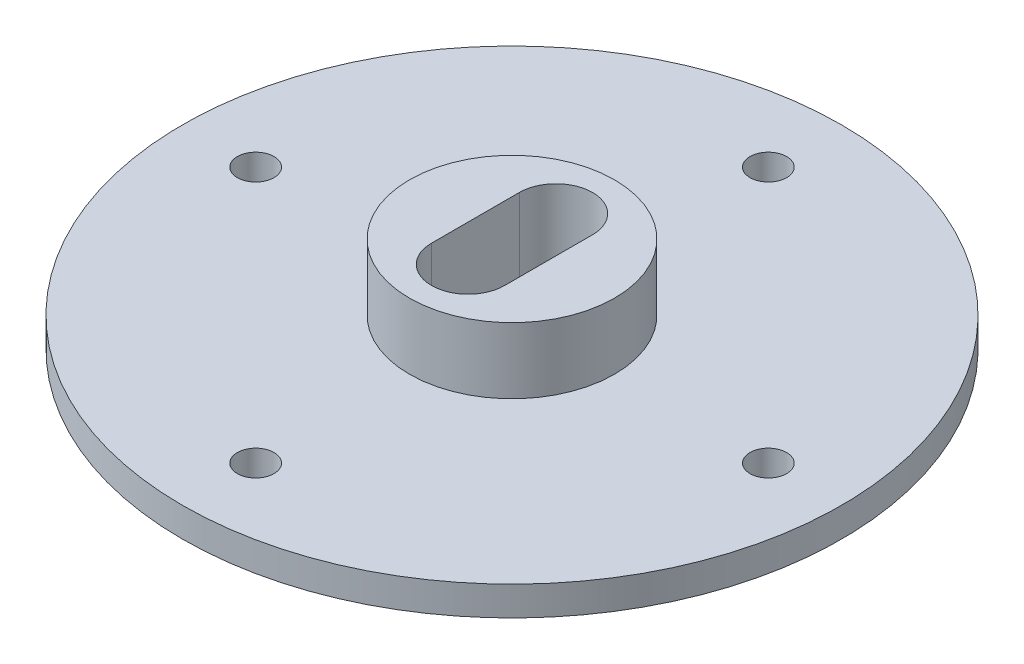
ISO-10303-21;
HEADER;
FILE_DESCRIPTION(('STEP AP214'),'2;1');
FILE_NAME('part.step','',(''),(''),'','','');
FILE_SCHEMA(('AUTOMOTIVE_DESIGN { 1 0 10303 214 1 1 1 1 }'));
ENDSEC;
DATA;
#1=APPLICATION_CONTEXT('core data for automotive mechanical design processes');
#2=APPLICATION_PROTOCOL_DEFINITION('international standard','automotive_design',2000,#1);
#3=PRODUCT_CONTEXT('',#1,'mechanical');
#4=PRODUCT('Part','Part','',(#3));
#5=PRODUCT_RELATED_PRODUCT_CATEGORY('part','',(#4));
#6=PRODUCT_DEFINITION_FORMATION('','',#4);
#7=PRODUCT_DEFINITION_CONTEXT('part definition',#1,'design');
#8=PRODUCT_DEFINITION('design','',#6,#7);
#9=PRODUCT_DEFINITION_SHAPE('','',#8);
#10=(LENGTH_UNIT() NAMED_UNIT(*) SI_UNIT(.MILLI.,.METRE.));
#11=(NAMED_UNIT(*) PLANE_ANGLE_UNIT() SI_UNIT($,.RADIAN.));
#12=(NAMED_UNIT(*) SI_UNIT($,.STERADIAN.) SOLID_ANGLE_UNIT());
#13=UNCERTAINTY_MEASURE_WITH_UNIT(LENGTH_MEASURE(1.E-05),#10,'distance_accuracy_value','');
#14=(GEOMETRIC_REPRESENTATION_CONTEXT(3) GLOBAL_UNCERTAINTY_ASSIGNED_CONTEXT((#13)) GLOBAL_UNIT_ASSIGNED_CONTEXT((#10,
#11,#12)) REPRESENTATION_CONTEXT('',''));
#15=CARTESIAN_POINT('',(0.,0.,0.));
#16=DIRECTION('',(0.,0.,1.));
#17=DIRECTION('',(1.,0.,0.));
#18=AXIS2_PLACEMENT_3D('',#15,#16,#17);
#19=CARTESIAN_POINT('',(0.,4.,-35.));
#20=DIRECTION('',(0.,-1.,0.));
#21=DIRECTION('',(0.,0.,-1.));
#22=AXIS2_PLACEMENT_3D('',#19,#20,#21);
#23=CYLINDRICAL_SURFACE('',#22,2.5);
#24=CARTESIAN_POINT('',(0.,4.,-35.));
#25=DIRECTION('',(0.,1.,0.));
#26=DIRECTION('',(0.,0.,1.));
#27=AXIS2_PLACEMENT_3D('',#24,#25,#26);
#28=CIRCLE('',#27,2.5);
#29=CARTESIAN_POINT('',(0.,4.,-32.5));
#30=VERTEX_POINT('',#29);
#31=EDGE_CURVE('E55',#30,#30,#28,.T.);
#32=ORIENTED_EDGE('',*,*,#31,.T.);
#33=EDGE_LOOP('',(#32));
#34=FACE_BOUND('',#33,.T.);
#35=CARTESIAN_POINT('',(0.,0.,-35.));
#36=DIRECTION('',(0.,1.,0.));
#37=DIRECTION('',(0.,0.,1.));
#38=AXIS2_PLACEMENT_3D('',#35,#36,#37);
#39=CIRCLE('',#38,2.5);
#40=CARTESIAN_POINT('',(0.,0.,-32.5));
#41=VERTEX_POINT('',#40);
#42=EDGE_CURVE('E171',#41,#41,#39,.T.);
#43=ORIENTED_EDGE('',*,*,#42,.F.);
#44=EDGE_LOOP('',(#43));
#45=FACE_BOUND('',#44,.T.);
#46=ADVANCED_FACE('F45',(#34,#45),#23,.F.);
#47=CARTESIAN_POINT('',(35.000000000001,4.,-9.88330434368617E-13));
#48=DIRECTION('',(0.,-1.,0.));
#49=DIRECTION('',(0.,0.,-1.));
#50=AXIS2_PLACEMENT_3D('',#47,#48,#49);
#51=CYLINDRICAL_SURFACE('',#50,2.50000000000077);
#52=CARTESIAN_POINT('',(35.000000000001,4.,-9.88330434368617E-13));
#53=DIRECTION('',(0.,1.,0.));
#54=DIRECTION('',(0.,0.,1.));
#55=AXIS2_PLACEMENT_3D('',#52,#53,#54);
#56=CIRCLE('',#55,2.50000000000077);
#57=CARTESIAN_POINT('',(35.000000000001,4.,2.49999999999979));
#58=VERTEX_POINT('',#57);
#59=EDGE_CURVE('E154',#58,#58,#56,.T.);
#60=ORIENTED_EDGE('',*,*,#59,.T.);
#61=EDGE_LOOP('',(#60));
#62=FACE_BOUND('',#61,.T.);
#63=CARTESIAN_POINT('',(35.000000000001,0.,-9.88330434368617E-13));
#64=DIRECTION('',(0.,1.,0.));
#65=DIRECTION('',(0.,0.,1.));
#66=AXIS2_PLACEMENT_3D('',#63,#64,#65);
#67=CIRCLE('',#66,2.50000000000077);
#68=CARTESIAN_POINT('',(35.000000000001,0.,2.49999999999979));
#69=VERTEX_POINT('',#68);
#70=EDGE_CURVE('E168',#69,#69,#67,.T.);
#71=ORIENTED_EDGE('',*,*,#70,.F.);
#72=EDGE_LOOP('',(#71));
#73=FACE_BOUND('',#72,.T.);
#74=ADVANCED_FACE('F197',(#62,#73),#51,.F.);
#75=CARTESIAN_POINT('',(1.97666086873723E-12,4.,35.));
#76=DIRECTION('',(0.,-1.,0.));
#77=DIRECTION('',(0.,0.,-1.));
#78=AXIS2_PLACEMENT_3D('',#75,#76,#77);
#79=CYLINDRICAL_SURFACE('',#78,2.50000000000213);
#80=CARTESIAN_POINT('',(1.97666086873723E-12,4.,35.));
#81=DIRECTION('',(0.,1.,0.));
#82=DIRECTION('',(0.,0.,1.));
#83=AXIS2_PLACEMENT_3D('',#80,#81,#82);
#84=CIRCLE('',#83,2.50000000000213);
#85=CARTESIAN_POINT('',(1.97666086873723E-12,4.,37.5000000000021));
#86=VERTEX_POINT('',#85);
#87=EDGE_CURVE('E150',#86,#86,#84,.T.);
#88=ORIENTED_EDGE('',*,*,#87,.T.);
#89=EDGE_LOOP('',(#88));
#90=FACE_BOUND('',#89,.T.);
#91=CARTESIAN_POINT('',(1.97666086873723E-12,0.,35.));
#92=DIRECTION('',(0.,1.,0.));
#93=DIRECTION('',(0.,0.,1.));
#94=AXIS2_PLACEMENT_3D('',#91,#92,#93);
#95=CIRCLE('',#94,2.50000000000213);
#96=CARTESIAN_POINT('',(1.97666086873723E-12,0.,37.5000000000021));
#97=VERTEX_POINT('',#96);
#98=EDGE_CURVE('E164',#97,#97,#95,.T.);
#99=ORIENTED_EDGE('',*,*,#98,.F.);
#100=EDGE_LOOP('',(#99));
#101=FACE_BOUND('',#100,.T.);
#102=ADVANCED_FACE('F203',(#90,#101),#79,.F.);
#103=CARTESIAN_POINT('',(-34.999999999999,4.,9.92616698165632E-13));
#104=DIRECTION('',(0.,-1.,0.));
#105=DIRECTION('',(0.,0.,-1.));
#106=AXIS2_PLACEMENT_3D('',#103,#104,#105);
#107=CYLINDRICAL_SURFACE('',#106,2.50000000000159);
#108=CARTESIAN_POINT('',(-34.999999999999,4.,9.92616698165632E-13));
#109=DIRECTION('',(0.,1.,0.));
#110=DIRECTION('',(0.,0.,1.));
#111=AXIS2_PLACEMENT_3D('',#108,#109,#110);
#112=CIRCLE('',#111,2.50000000000159);
#113=CARTESIAN_POINT('',(-34.999999999999,4.,2.50000000000258));
#114=VERTEX_POINT('',#113);
#115=EDGE_CURVE('E146',#114,#114,#112,.T.);
#116=ORIENTED_EDGE('',*,*,#115,.T.);
#117=EDGE_LOOP('',(#116));
#118=FACE_BOUND('',#117,.T.);
#119=CARTESIAN_POINT('',(-34.999999999999,0.,9.92616698165632E-13));
#120=DIRECTION('',(0.,1.,0.));
#121=DIRECTION('',(0.,0.,1.));
#122=AXIS2_PLACEMENT_3D('',#119,#120,#121);
#123=CIRCLE('',#122,2.50000000000159);
#124=CARTESIAN_POINT('',(-34.999999999999,0.,2.50000000000258));
#125=VERTEX_POINT('',#124);
#126=EDGE_CURVE('E145',#125,#125,#123,.T.);
#127=ORIENTED_EDGE('',*,*,#126,.F.);
#128=EDGE_LOOP('',(#127));
#129=FACE_BOUND('',#128,.T.);
#130=ADVANCED_FACE('F47',(#118,#129),#107,.F.);
#131=CARTESIAN_POINT('',(0.,4.,0.));
#132=DIRECTION('',(0.,-1.,0.));
#133=DIRECTION('',(0.,0.,-1.));
#134=AXIS2_PLACEMENT_3D('',#131,#132,#133);
#135=CYLINDRICAL_SURFACE('',#134,45.);
#136=CARTESIAN_POINT('',(0.,4.,0.));
#137=DIRECTION('',(0.,1.,0.));
#138=DIRECTION('',(0.,0.,1.));
#139=AXIS2_PLACEMENT_3D('',#136,#137,#138);
#140=CIRCLE('',#139,45.);
#141=CARTESIAN_POINT('',(0.,4.,45.));
#142=VERTEX_POINT('',#141);
#143=EDGE_CURVE('E11',#142,#142,#140,.T.);
#144=ORIENTED_EDGE('',*,*,#143,.F.);
#145=EDGE_LOOP('',(#144));
#146=FACE_BOUND('',#145,.T.);
#147=CARTESIAN_POINT('',(0.,0.,0.));
#148=DIRECTION('',(0.,1.,0.));
#149=DIRECTION('',(0.,0.,1.));
#150=AXIS2_PLACEMENT_3D('',#147,#148,#149);
#151=CIRCLE('',#150,45.);
#152=CARTESIAN_POINT('',(0.,0.,45.));
#153=VERTEX_POINT('',#152);
#154=EDGE_CURVE('E49',#153,#153,#151,.T.);
#155=ORIENTED_EDGE('',*,*,#154,.T.);
#156=EDGE_LOOP('',(#155));
#157=FACE_BOUND('',#156,.T.);
#158=ADVANCED_FACE('F180',(#146,#157),#135,.T.);
#159=CARTESIAN_POINT('',(0.,4.,0.));
#160=DIRECTION('',(0.,1.,0.));
#161=DIRECTION('',(0.,0.,1.));
#162=AXIS2_PLACEMENT_3D('',#159,#160,#161);
#163=PLANE('',#162);
#164=CARTESIAN_POINT('',(0.,4.,0.));
#165=DIRECTION('',(0.,1.,0.));
#166=DIRECTION('',(0.,0.,1.));
#167=AXIS2_PLACEMENT_3D('',#164,#165,#166);
#168=CIRCLE('',#167,14.);
#169=CARTESIAN_POINT('',(0.,4.,-14.));
#170=VERTEX_POINT('',#169);
#171=EDGE_CURVE('E141',#170,#170,#168,.F.);
#172=ORIENTED_EDGE('',*,*,#171,.T.);
#173=EDGE_LOOP('',(#172));
#174=FACE_BOUND('',#173,.T.);
#175=ORIENTED_EDGE('',*,*,#115,.F.);
#176=EDGE_LOOP('',(#175));
#177=FACE_BOUND('',#176,.T.);
#178=ORIENTED_EDGE('',*,*,#87,.F.);
#179=EDGE_LOOP('',(#178));
#180=FACE_BOUND('',#179,.T.);
#181=ORIENTED_EDGE('',*,*,#59,.F.);
#182=EDGE_LOOP('',(#181));
#183=FACE_BOUND('',#182,.T.);
#184=ORIENTED_EDGE('',*,*,#31,.F.);
#185=EDGE_LOOP('',(#184));
#186=FACE_BOUND('',#185,.T.);
#187=ORIENTED_EDGE('',*,*,#143,.T.);
#188=EDGE_LOOP('',(#187));
#189=FACE_BOUND('',#188,.T.);
#190=ADVANCED_FACE('F184',(#174,#177,#180,#183,#186,#189),#163,.T.);
#191=CARTESIAN_POINT('',(0.,0.,0.));
#192=DIRECTION('',(0.,1.,0.));
#193=DIRECTION('',(0.,0.,1.));
#194=AXIS2_PLACEMENT_3D('',#191,#192,#193);
#195=PLANE('',#194);
#196=DIRECTION('',(0.,0.,1.));
#197=VECTOR('',#196,1.);
#198=CARTESIAN_POINT('',(-5.,0.,6.));
#199=LINE('',#198,#197);
#200=CARTESIAN_POINT('',(-5.,0.,-6.));
#201=VERTEX_POINT('',#200);
#202=CARTESIAN_POINT('',(-5.,0.,6.));
#203=VERTEX_POINT('',#202);
#204=EDGE_CURVE('E98',#201,#203,#199,.T.);
#205=ORIENTED_EDGE('',*,*,#204,.T.);
#206=CARTESIAN_POINT('',(0.,0.,6.));
#207=DIRECTION('',(0.,1.,0.));
#208=DIRECTION('',(0.,0.,1.));
#209=AXIS2_PLACEMENT_3D('',#206,#207,#208);
#210=CIRCLE('',#209,5.);
#211=CARTESIAN_POINT('',(5.,0.,6.));
#212=VERTEX_POINT('',#211);
#213=EDGE_CURVE('E91',#203,#212,#210,.T.);
#214=ORIENTED_EDGE('',*,*,#213,.T.);
#215=DIRECTION('',(0.,0.,-1.));
#216=VECTOR('',#215,1.);
#217=CARTESIAN_POINT('',(5.,0.,6.));
#218=LINE('',#217,#216);
#219=CARTESIAN_POINT('',(5.,0.,-6.));
#220=VERTEX_POINT('',#219);
#221=EDGE_CURVE('E101',#212,#220,#218,.T.);
#222=ORIENTED_EDGE('',*,*,#221,.T.);
#223=CARTESIAN_POINT('',(0.,0.,-6.));
#224=DIRECTION('',(0.,1.,0.));
#225=DIRECTION('',(0.,0.,1.));
#226=AXIS2_PLACEMENT_3D('',#223,#224,#225);
#227=CIRCLE('',#226,5.);
#228=EDGE_CURVE('E63',#220,#201,#227,.T.);
#229=ORIENTED_EDGE('',*,*,#228,.T.);
#230=EDGE_LOOP('',(#205,#214,#222,#229));
#231=FACE_BOUND('',#230,.T.);
#232=ORIENTED_EDGE('',*,*,#126,.T.);
#233=EDGE_LOOP('',(#232));
#234=FACE_BOUND('',#233,.T.);
#235=ORIENTED_EDGE('',*,*,#98,.T.);
#236=EDGE_LOOP('',(#235));
#237=FACE_BOUND('',#236,.T.);
#238=ORIENTED_EDGE('',*,*,#70,.T.);
#239=EDGE_LOOP('',(#238));
#240=FACE_BOUND('',#239,.T.);
#241=ORIENTED_EDGE('',*,*,#42,.T.);
#242=EDGE_LOOP('',(#241));
#243=FACE_BOUND('',#242,.T.);
#244=ORIENTED_EDGE('',*,*,#154,.F.);
#245=EDGE_LOOP('',(#244));
#246=FACE_BOUND('',#245,.T.);
#247=ADVANCED_FACE('F106',(#231,#234,#237,#240,#243,#246),#195,.F.);
#248=CARTESIAN_POINT('',(0.,13.,0.));
#249=DIRECTION('',(0.,-1.,0.));
#250=DIRECTION('',(0.,0.,-1.));
#251=AXIS2_PLACEMENT_3D('',#248,#249,#250);
#252=CYLINDRICAL_SURFACE('',#251,14.);
#253=CARTESIAN_POINT('',(0.,13.,0.));
#254=DIRECTION('',(0.,1.,0.));
#255=DIRECTION('',(0.,0.,1.));
#256=AXIS2_PLACEMENT_3D('',#253,#254,#255);
#257=CIRCLE('',#256,14.);
#258=CARTESIAN_POINT('',(0.,13.,-14.));
#259=VERTEX_POINT('',#258);
#260=EDGE_CURVE('E132',#259,#259,#257,.T.);
#261=CARTESIAN_POINT('',(0.,4.,-14.));
#262=CARTESIAN_POINT('',(0.,4.09375,-14.));
#263=CARTESIAN_POINT('',(0.,4.1875,-14.));
#264=CARTESIAN_POINT('',(0.,4.375,-14.));
#265=CARTESIAN_POINT('',(0.,4.46875,-14.));
#266=CARTESIAN_POINT('',(0.,4.65625,-14.));
#267=CARTESIAN_POINT('',(0.,4.75,-14.));
#268=CARTESIAN_POINT('',(0.,4.9375,-14.));
#269=CARTESIAN_POINT('',(0.,5.03125,-14.));
#270=CARTESIAN_POINT('',(0.,5.21875,-14.));
#271=CARTESIAN_POINT('',(0.,5.3125,-14.));
#272=CARTESIAN_POINT('',(0.,5.5,-14.));
#273=CARTESIAN_POINT('',(0.,5.59375,-14.));
#274=CARTESIAN_POINT('',(0.,5.78125,-14.));
#275=CARTESIAN_POINT('',(0.,5.875,-14.));
#276=CARTESIAN_POINT('',(0.,6.0625,-14.));
#277=CARTESIAN_POINT('',(0.,6.15625,-14.));
#278=CARTESIAN_POINT('',(0.,6.34375,-14.));
#279=CARTESIAN_POINT('',(0.,6.4375,-14.));
#280=CARTESIAN_POINT('',(0.,6.625,-14.));
#281=CARTESIAN_POINT('',(0.,6.71875,-14.));
#282=CARTESIAN_POINT('',(0.,6.90625,-14.));
#283=CARTESIAN_POINT('',(0.,7.,-14.));
#284=CARTESIAN_POINT('',(0.,7.1875,-14.));
#285=CARTESIAN_POINT('',(0.,7.28125,-14.));
#286=CARTESIAN_POINT('',(0.,7.46875,-14.));
#287=CARTESIAN_POINT('',(0.,7.5625,-14.));
#288=CARTESIAN_POINT('',(0.,7.75,-14.));
#289=CARTESIAN_POINT('',(0.,7.84375,-14.));
#290=CARTESIAN_POINT('',(0.,8.03125,-14.));
#291=CARTESIAN_POINT('',(0.,8.125,-14.));
#292=CARTESIAN_POINT('',(0.,8.3125,-14.));
#293=CARTESIAN_POINT('',(0.,8.40625,-14.));
#294=CARTESIAN_POINT('',(0.,8.59375,-14.));
#295=CARTESIAN_POINT('',(0.,8.6875,-14.));
#296=CARTESIAN_POINT('',(0.,8.875,-14.));
#297=CARTESIAN_POINT('',(0.,8.96875,-14.));
#298=CARTESIAN_POINT('',(0.,9.15625,-14.));
#299=CARTESIAN_POINT('',(0.,9.25,-14.));
#300=CARTESIAN_POINT('',(0.,9.4375,-14.));
#301=CARTESIAN_POINT('',(0.,9.53125,-14.));
#302=CARTESIAN_POINT('',(0.,9.71875,-14.));
#303=CARTESIAN_POINT('',(0.,9.8125,-14.));
#304=CARTESIAN_POINT('',(0.,10.,-14.));
#305=CARTESIAN_POINT('',(0.,10.09375,-14.));
#306=CARTESIAN_POINT('',(0.,10.28125,-14.));
#307=CARTESIAN_POINT('',(0.,10.375,-14.));
#308=CARTESIAN_POINT('',(0.,10.5625,-14.));
#309=CARTESIAN_POINT('',(0.,10.65625,-14.));
#310=CARTESIAN_POINT('',(0.,10.84375,-14.));
#311=CARTESIAN_POINT('',(0.,10.9375,-14.));
#312=CARTESIAN_POINT('',(0.,11.125,-14.));
#313=CARTESIAN_POINT('',(0.,11.21875,-14.));
#314=CARTESIAN_POINT('',(0.,11.40625,-14.));
#315=CARTESIAN_POINT('',(0.,11.5,-14.));
#316=CARTESIAN_POINT('',(0.,11.6875,-14.));
#317=CARTESIAN_POINT('',(0.,11.78125,-14.));
#318=CARTESIAN_POINT('',(0.,11.96875,-14.));
#319=CARTESIAN_POINT('',(0.,12.0625,-14.));
#320=CARTESIAN_POINT('',(0.,12.25,-14.));
#321=CARTESIAN_POINT('',(0.,12.34375,-14.));
#322=CARTESIAN_POINT('',(0.,12.53125,-14.));
#323=CARTESIAN_POINT('',(0.,12.625,-14.));
#324=CARTESIAN_POINT('',(0.,12.8125,-14.));
#325=CARTESIAN_POINT('',(0.,12.90625,-14.));
#326=CARTESIAN_POINT('',(0.,13.,-14.));
#327=B_SPLINE_CURVE_WITH_KNOTS('',3,(#261,#262,#263,#264,#265,#266,#267,#268,#269,#270,#271,
#272,#273,#274,#275,#276,#277,#278,#279,#280,#281,#282,#283,#284,#285,#286,#287,#288,#289,#290,
#291,#292,#293,#294,#295,#296,#297,#298,#299,#300,#301,#302,#303,#304,#305,#306,#307,#308,#309,
#310,#311,#312,#313,#314,#315,#316,#317,#318,#319,#320,#321,#322,#323,#324,#325,#326),
.UNSPECIFIED.,.F.,.F.,(4,2,2,2,2,2,2,2,2,2,2,2,2,2,2,2,2,2,2,2,2,2,2,2,2,2,2,2,2,2,2,2,4),(0.,
0.28125,0.5625,0.843750000000001,1.125,1.40625,1.6875,1.96875,2.25,2.53125,2.8125,3.09375,3.375,
3.65625,3.9375,4.21875,4.5,4.78125,5.0625,5.34375,5.625,5.90625,6.1875,6.46875,6.75,7.03125,
7.3125,7.59375,7.875,8.15625,8.4375,8.71875,9.),.UNSPECIFIED.);
#328=EDGE_CURVE('BSEAM183',#170,#259,#327,.T.);
#329=ORIENTED_EDGE('',*,*,#171,.F.);
#330=ORIENTED_EDGE('',*,*,#260,.F.);
#331=ORIENTED_EDGE('',*,*,#328,.T.);
#332=ORIENTED_EDGE('',*,*,#328,.F.);
#333=EDGE_LOOP('',(#329,#331,#330,#332));
#334=FACE_BOUND('',#333,.T.);
#335=ADVANCED_FACE('F183',(#334),#252,.T.);
#336=CARTESIAN_POINT('',(0.,13.,0.));
#337=DIRECTION('',(0.,1.,0.));
#338=DIRECTION('',(0.,0.,1.));
#339=AXIS2_PLACEMENT_3D('',#336,#337,#338);
#340=PLANE('',#339);
#341=CARTESIAN_POINT('',(0.,13.,6.));
#342=DIRECTION('',(0.,1.,0.));
#343=DIRECTION('',(0.,0.,1.));
#344=AXIS2_PLACEMENT_3D('',#341,#342,#343);
#345=CIRCLE('',#344,5.);
#346=CARTESIAN_POINT('',(-5.,13.,6.));
#347=VERTEX_POINT('',#346);
#348=CARTESIAN_POINT('',(5.,13.,6.));
#349=VERTEX_POINT('',#348);
#350=EDGE_CURVE('E71',#347,#349,#345,.T.);
#351=ORIENTED_EDGE('',*,*,#350,.F.);
#352=DIRECTION('',(0.,0.,1.));
#353=VECTOR('',#352,1.);
#354=CARTESIAN_POINT('',(-5.,13.,6.));
#355=LINE('',#354,#353);
#356=CARTESIAN_POINT('',(-5.,13.,-6.));
#357=VERTEX_POINT('',#356);
#358=EDGE_CURVE('E110',#357,#347,#355,.T.);
#359=ORIENTED_EDGE('',*,*,#358,.F.);
#360=CARTESIAN_POINT('',(0.,13.,-6.));
#361=DIRECTION('',(0.,1.,0.));
#362=DIRECTION('',(0.,0.,1.));
#363=AXIS2_PLACEMENT_3D('',#360,#361,#362);
#364=CIRCLE('',#363,5.);
#365=CARTESIAN_POINT('',(5.,13.,-6.));
#366=VERTEX_POINT('',#365);
#367=EDGE_CURVE('E114',#366,#357,#364,.T.);
#368=ORIENTED_EDGE('',*,*,#367,.F.);
#369=DIRECTION('',(0.,0.,-1.));
#370=VECTOR('',#369,1.);
#371=CARTESIAN_POINT('',(5.,13.,6.));
#372=LINE('',#371,#370);
#373=EDGE_CURVE('E123',#349,#366,#372,.T.);
#374=ORIENTED_EDGE('',*,*,#373,.F.);
#375=EDGE_LOOP('',(#351,#359,#368,#374));
#376=FACE_BOUND('',#375,.T.);
#377=ORIENTED_EDGE('',*,*,#260,.T.);
#378=EDGE_LOOP('',(#377));
#379=FACE_BOUND('',#378,.T.);
#380=ADVANCED_FACE('F190',(#376,#379),#340,.T.);
#381=CARTESIAN_POINT('',(0.,0.,6.));
#382=DIRECTION('',(0.,1.,0.));
#383=DIRECTION('',(0.,0.,1.));
#384=AXIS2_PLACEMENT_3D('',#381,#382,#383);
#385=CYLINDRICAL_SURFACE('',#384,5.);
#386=ORIENTED_EDGE('',*,*,#350,.T.);
#387=DIRECTION('',(0.,1.,0.));
#388=VECTOR('',#387,1.);
#389=CARTESIAN_POINT('',(5.,0.,6.));
#390=LINE('',#389,#388);
#391=EDGE_CURVE('E87',#212,#349,#390,.T.);
#392=ORIENTED_EDGE('',*,*,#391,.F.);
#393=ORIENTED_EDGE('',*,*,#213,.F.);
#394=DIRECTION('',(0.,1.,0.));
#395=VECTOR('',#394,1.);
#396=CARTESIAN_POINT('',(-5.,0.,6.));
#397=LINE('',#396,#395);
#398=EDGE_CURVE('E129',#203,#347,#397,.T.);
#399=ORIENTED_EDGE('',*,*,#398,.T.);
#400=EDGE_LOOP('',(#386,#392,#393,#399));
#401=FACE_BOUND('',#400,.T.);
#402=ADVANCED_FACE('F89',(#401),#385,.F.);
#403=CARTESIAN_POINT('',(-5.,0.,6.));
#404=DIRECTION('',(-1.,0.,0.));
#405=DIRECTION('',(0.,0.,1.));
#406=AXIS2_PLACEMENT_3D('',#403,#404,#405);
#407=PLANE('',#406);
#408=ORIENTED_EDGE('',*,*,#358,.T.);
#409=ORIENTED_EDGE('',*,*,#398,.F.);
#410=ORIENTED_EDGE('',*,*,#204,.F.);
#411=DIRECTION('',(0.,1.,0.));
#412=VECTOR('',#411,1.);
#413=CARTESIAN_POINT('',(-5.,0.,-6.));
#414=LINE('',#413,#412);
#415=EDGE_CURVE('E133',#201,#357,#414,.T.);
#416=ORIENTED_EDGE('',*,*,#415,.T.);
#417=EDGE_LOOP('',(#408,#409,#410,#416));
#418=FACE_BOUND('',#417,.T.);
#419=ADVANCED_FACE('F269',(#418),#407,.F.);
#420=CARTESIAN_POINT('',(0.,0.,-6.));
#421=DIRECTION('',(0.,1.,0.));
#422=DIRECTION('',(0.,0.,1.));
#423=AXIS2_PLACEMENT_3D('',#420,#421,#422);
#424=CYLINDRICAL_SURFACE('',#423,5.);
#425=ORIENTED_EDGE('',*,*,#367,.T.);
#426=ORIENTED_EDGE('',*,*,#415,.F.);
#427=ORIENTED_EDGE('',*,*,#228,.F.);
#428=DIRECTION('',(0.,1.,0.));
#429=VECTOR('',#428,1.);
#430=CARTESIAN_POINT('',(5.,0.,-6.));
#431=LINE('',#430,#429);
#432=EDGE_CURVE('E97',#220,#366,#431,.T.);
#433=ORIENTED_EDGE('',*,*,#432,.T.);
#434=EDGE_LOOP('',(#425,#426,#427,#433));
#435=FACE_BOUND('',#434,.T.);
#436=ADVANCED_FACE('F279',(#435),#424,.F.);
#437=CARTESIAN_POINT('',(5.,0.,6.));
#438=DIRECTION('',(1.,0.,0.));
#439=DIRECTION('',(0.,0.,-1.));
#440=AXIS2_PLACEMENT_3D('',#437,#438,#439);
#441=PLANE('',#440);
#442=ORIENTED_EDGE('',*,*,#373,.T.);
#443=ORIENTED_EDGE('',*,*,#432,.F.);
#444=ORIENTED_EDGE('',*,*,#221,.F.);
#445=ORIENTED_EDGE('',*,*,#391,.T.);
#446=EDGE_LOOP('',(#442,#443,#444,#445));
#447=FACE_BOUND('',#446,.T.);
#448=ADVANCED_FACE('F102',(#447),#441,.F.);
#449=CLOSED_SHELL('',(#46,#74,#102,#130,#158,#190,#247,#335,#380,#402,#419,#436,#448));
#450=MANIFOLD_SOLID_BREP('B2',#449);
#451=ADVANCED_BREP_SHAPE_REPRESENTATION('',(#18,#450),#14);
#452=SHAPE_DEFINITION_REPRESENTATION(#9,#451);
ENDSEC;
END-ISO-10303-21;
